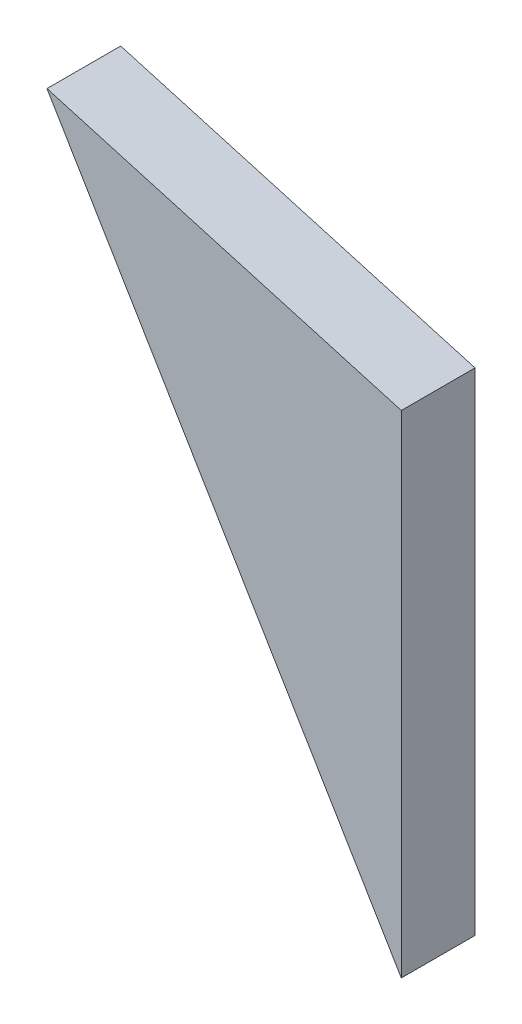
ISO-10303-21;
HEADER;
FILE_DESCRIPTION(('STEP AP214'),'2;1');
FILE_NAME('part.step','',(''),(''),'','','');
FILE_SCHEMA(('AUTOMOTIVE_DESIGN { 1 0 10303 214 1 1 1 1 }'));
ENDSEC;
DATA;
#1=APPLICATION_CONTEXT('core data for automotive mechanical design processes');
#2=APPLICATION_PROTOCOL_DEFINITION('international standard','automotive_design',2000,#1);
#3=PRODUCT_CONTEXT('',#1,'mechanical');
#4=PRODUCT('Part','Part','',(#3));
#5=PRODUCT_RELATED_PRODUCT_CATEGORY('part','',(#4));
#6=PRODUCT_DEFINITION_FORMATION('','',#4);
#7=PRODUCT_DEFINITION_CONTEXT('part definition',#1,'design');
#8=PRODUCT_DEFINITION('design','',#6,#7);
#9=PRODUCT_DEFINITION_SHAPE('','',#8);
#10=(LENGTH_UNIT() NAMED_UNIT(*) SI_UNIT(.MILLI.,.METRE.));
#11=(NAMED_UNIT(*) PLANE_ANGLE_UNIT() SI_UNIT($,.RADIAN.));
#12=(NAMED_UNIT(*) SI_UNIT($,.STERADIAN.) SOLID_ANGLE_UNIT());
#13=UNCERTAINTY_MEASURE_WITH_UNIT(LENGTH_MEASURE(1.E-05),#10,'distance_accuracy_value','');
#14=(GEOMETRIC_REPRESENTATION_CONTEXT(3) GLOBAL_UNCERTAINTY_ASSIGNED_CONTEXT((#13)) GLOBAL_UNIT_ASSIGNED_CONTEXT((#10,
#11,#12)) REPRESENTATION_CONTEXT('',''));
#15=CARTESIAN_POINT('',(0.,0.,0.));
#16=DIRECTION('',(0.,0.,1.));
#17=DIRECTION('',(1.,0.,0.));
#18=AXIS2_PLACEMENT_3D('',#15,#16,#17);
#19=CARTESIAN_POINT('',(-14.4189254390748,4.13456033725478,3.));
#20=DIRECTION('',(-0.275637355816986,-0.961261695938323,0.));
#21=DIRECTION('',(0.961261695938323,-0.275637355816986,0.));
#22=AXIS2_PLACEMENT_3D('',#19,#20,#21);
#23=PLANE('',#22);
#24=DIRECTION('',(-0.961261695938323,0.275637355816986,0.));
#25=VECTOR('',#24,1.);
#26=CARTESIAN_POINT('',(-14.4189254390748,4.13456033725478,0.));
#27=LINE('',#26,#25);
#28=CARTESIAN_POINT('',(0.,0.,0.));
#29=VERTEX_POINT('',#28);
#30=CARTESIAN_POINT('',(-14.4189254390748,4.13456033725478,0.));
#31=VERTEX_POINT('',#30);
#32=EDGE_CURVE('E80',#29,#31,#27,.T.);
#33=ORIENTED_EDGE('',*,*,#32,.T.);
#34=DIRECTION('',(0.,0.,-1.));
#35=VECTOR('',#34,1.);
#36=CARTESIAN_POINT('',(-14.4189254390748,4.13456033725478,3.));
#37=LINE('',#36,#35);
#38=CARTESIAN_POINT('',(-14.4189254390748,4.13456033725478,3.));
#39=VERTEX_POINT('',#38);
#40=EDGE_CURVE('E11',#39,#31,#37,.T.);
#41=ORIENTED_EDGE('',*,*,#40,.F.);
#42=DIRECTION('',(-0.961261695938323,0.275637355816986,0.));
#43=VECTOR('',#42,1.);
#44=CARTESIAN_POINT('',(-14.4189254390748,4.13456033725478,3.));
#45=LINE('',#44,#43);
#46=CARTESIAN_POINT('',(0.,0.,3.));
#47=VERTEX_POINT('',#46);
#48=EDGE_CURVE('E73',#47,#39,#45,.T.);
#49=ORIENTED_EDGE('',*,*,#48,.F.);
#50=DIRECTION('',(0.,0.,-1.));
#51=VECTOR('',#50,1.);
#52=CARTESIAN_POINT('',(0.,0.,3.));
#53=LINE('',#52,#51);
#54=EDGE_CURVE('E81',#47,#29,#53,.T.);
#55=ORIENTED_EDGE('',*,*,#54,.T.);
#56=EDGE_LOOP('',(#33,#41,#49,#55));
#57=FACE_BOUND('',#56,.T.);
#58=ADVANCED_FACE('F33',(#57),#23,.F.);
#59=CARTESIAN_POINT('',(0.,-20.,3.));
#60=DIRECTION('',(0.858461370735183,0.512878226244272,0.));
#61=DIRECTION('',(-0.512878226244272,0.858461370735183,0.));
#62=AXIS2_PLACEMENT_3D('',#59,#60,#61);
#63=PLANE('',#62);
#64=DIRECTION('',(0.512878226244272,-0.858461370735183,0.));
#65=VECTOR('',#64,1.);
#66=CARTESIAN_POINT('',(0.,-20.,0.));
#67=LINE('',#66,#65);
#68=CARTESIAN_POINT('',(0.,-20.,0.));
#69=VERTEX_POINT('',#68);
#70=EDGE_CURVE('E61',#31,#69,#67,.T.);
#71=ORIENTED_EDGE('',*,*,#70,.T.);
#72=DIRECTION('',(0.,0.,-1.));
#73=VECTOR('',#72,1.);
#74=CARTESIAN_POINT('',(0.,-20.,3.));
#75=LINE('',#74,#73);
#76=CARTESIAN_POINT('',(0.,-20.,3.));
#77=VERTEX_POINT('',#76);
#78=EDGE_CURVE('E41',#77,#69,#75,.T.);
#79=ORIENTED_EDGE('',*,*,#78,.F.);
#80=DIRECTION('',(0.512878226244272,-0.858461370735183,0.));
#81=VECTOR('',#80,1.);
#82=CARTESIAN_POINT('',(0.,-20.,3.));
#83=LINE('',#82,#81);
#84=EDGE_CURVE('E69',#39,#77,#83,.T.);
#85=ORIENTED_EDGE('',*,*,#84,.F.);
#86=ORIENTED_EDGE('',*,*,#40,.T.);
#87=EDGE_LOOP('',(#71,#79,#85,#86));
#88=FACE_BOUND('',#87,.T.);
#89=ADVANCED_FACE('F70',(#88),#63,.F.);
#90=CARTESIAN_POINT('',(0.,0.,3.));
#91=DIRECTION('',(-1.,0.,0.));
#92=DIRECTION('',(0.,-1.,0.));
#93=AXIS2_PLACEMENT_3D('',#90,#91,#92);
#94=PLANE('',#93);
#95=DIRECTION('',(0.,1.,0.));
#96=VECTOR('',#95,1.);
#97=CARTESIAN_POINT('',(0.,0.,0.));
#98=LINE('',#97,#96);
#99=EDGE_CURVE('E66',#69,#29,#98,.T.);
#100=ORIENTED_EDGE('',*,*,#99,.T.);
#101=ORIENTED_EDGE('',*,*,#54,.F.);
#102=DIRECTION('',(0.,1.,0.));
#103=VECTOR('',#102,1.);
#104=CARTESIAN_POINT('',(0.,0.,3.));
#105=LINE('',#104,#103);
#106=EDGE_CURVE('E49',#77,#47,#105,.T.);
#107=ORIENTED_EDGE('',*,*,#106,.F.);
#108=ORIENTED_EDGE('',*,*,#78,.T.);
#109=EDGE_LOOP('',(#100,#101,#107,#108));
#110=FACE_BOUND('',#109,.T.);
#111=ADVANCED_FACE('F88',(#110),#94,.F.);
#112=CARTESIAN_POINT('',(0.,0.,3.));
#113=DIRECTION('',(0.,0.,-1.));
#114=DIRECTION('',(-1.,0.,0.));
#115=AXIS2_PLACEMENT_3D('',#112,#113,#114);
#116=PLANE('',#115);
#117=ORIENTED_EDGE('',*,*,#48,.T.);
#118=ORIENTED_EDGE('',*,*,#84,.T.);
#119=ORIENTED_EDGE('',*,*,#106,.T.);
#120=EDGE_LOOP('',(#117,#118,#119));
#121=FACE_BOUND('',#120,.T.);
#122=ADVANCED_FACE('F76',(#121),#116,.F.);
#123=CARTESIAN_POINT('',(0.,0.,0.));
#124=DIRECTION('',(0.,0.,-1.));
#125=DIRECTION('',(-1.,0.,0.));
#126=AXIS2_PLACEMENT_3D('',#123,#124,#125);
#127=PLANE('',#126);
#128=ORIENTED_EDGE('',*,*,#32,.F.);
#129=ORIENTED_EDGE('',*,*,#99,.F.);
#130=ORIENTED_EDGE('',*,*,#70,.F.);
#131=EDGE_LOOP('',(#128,#129,#130));
#132=FACE_BOUND('',#131,.T.);
#133=ADVANCED_FACE('F89',(#132),#127,.T.);
#134=CLOSED_SHELL('',(#58,#89,#111,#122,#133));
#135=MANIFOLD_SOLID_BREP('B2',#134);
#136=ADVANCED_BREP_SHAPE_REPRESENTATION('',(#18,#135),#14);
#137=SHAPE_DEFINITION_REPRESENTATION(#9,#136);
ENDSEC;
END-ISO-10303-21;
